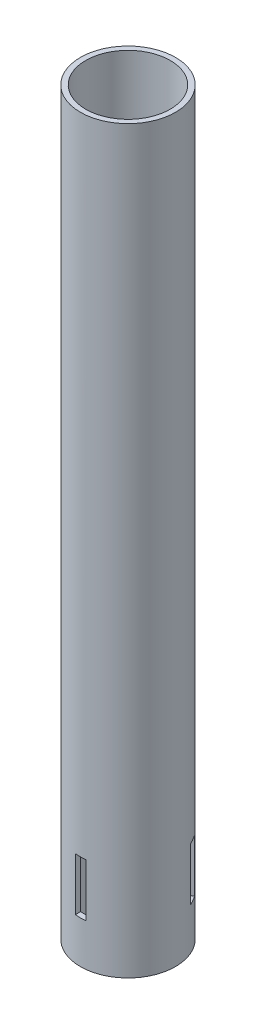
ISO-10303-21;
HEADER;
FILE_DESCRIPTION(('STEP AP214'),'2;1');
FILE_NAME('part.step','',(''),(''),'','','');
FILE_SCHEMA(('AUTOMOTIVE_DESIGN { 1 0 10303 214 1 1 1 1 }'));
ENDSEC;
DATA;
#1=APPLICATION_CONTEXT('core data for automotive mechanical design processes');
#2=APPLICATION_PROTOCOL_DEFINITION('international standard','automotive_design',2000,#1);
#3=PRODUCT_CONTEXT('',#1,'mechanical');
#4=PRODUCT('Part','Part','',(#3));
#5=PRODUCT_RELATED_PRODUCT_CATEGORY('part','',(#4));
#6=PRODUCT_DEFINITION_FORMATION('','',#4);
#7=PRODUCT_DEFINITION_CONTEXT('part definition',#1,'design');
#8=PRODUCT_DEFINITION('design','',#6,#7);
#9=PRODUCT_DEFINITION_SHAPE('','',#8);
#10=(LENGTH_UNIT() NAMED_UNIT(*) SI_UNIT(.MILLI.,.METRE.));
#11=(NAMED_UNIT(*) PLANE_ANGLE_UNIT() SI_UNIT($,.RADIAN.));
#12=(NAMED_UNIT(*) SI_UNIT($,.STERADIAN.) SOLID_ANGLE_UNIT());
#13=UNCERTAINTY_MEASURE_WITH_UNIT(LENGTH_MEASURE(1.E-05),#10,'distance_accuracy_value','');
#14=(GEOMETRIC_REPRESENTATION_CONTEXT(3) GLOBAL_UNCERTAINTY_ASSIGNED_CONTEXT((#13)) GLOBAL_UNIT_ASSIGNED_CONTEXT((#10,
#11,#12)) REPRESENTATION_CONTEXT('',''));
#15=CARTESIAN_POINT('',(0.,0.,0.));
#16=DIRECTION('',(0.,0.,1.));
#17=DIRECTION('',(1.,0.,0.));
#18=AXIS2_PLACEMENT_3D('',#15,#16,#17);
#19=CARTESIAN_POINT('',(0.,700.,0.));
#20=DIRECTION('',(0.,-1.,0.));
#21=DIRECTION('',(0.,0.,-1.));
#22=AXIS2_PLACEMENT_3D('',#19,#20,#21);
#23=CYLINDRICAL_SURFACE('',#22,45.);
#24=CARTESIAN_POINT('',(0.,40.,0.));
#25=DIRECTION('',(0.,1.,0.));
#26=DIRECTION('',(0.,0.,1.));
#27=AXIS2_PLACEMENT_3D('',#24,#25,#26);
#28=CIRCLE('',#27,45.);
#29=CARTESIAN_POINT('',(-5.,40.,44.7213595499958));
#30=VERTEX_POINT('',#29);
#31=CARTESIAN_POINT('',(5.,40.,44.7213595499958));
#32=VERTEX_POINT('',#31);
#33=EDGE_CURVE('E205',#30,#32,#28,.T.);
#34=ORIENTED_EDGE('',*,*,#33,.F.);
#35=DIRECTION('',(0.,-1.,0.));
#36=VECTOR('',#35,1.);
#37=CARTESIAN_POINT('',(-5.00000000000004,700.,44.7213595499958));
#38=LINE('',#37,#36);
#39=CARTESIAN_POINT('',(-5.00000000000004,90.,44.7213595499958));
#40=VERTEX_POINT('',#39);
#41=EDGE_CURVE('E194',#30,#40,#38,.F.);
#42=ORIENTED_EDGE('',*,*,#41,.T.);
#43=CARTESIAN_POINT('',(0.,90.,0.));
#44=DIRECTION('',(0.,1.,0.));
#45=DIRECTION('',(0.,0.,1.));
#46=AXIS2_PLACEMENT_3D('',#43,#44,#45);
#47=CIRCLE('',#46,45.);
#48=CARTESIAN_POINT('',(5.,90.,44.7213595499958));
#49=VERTEX_POINT('',#48);
#50=EDGE_CURVE('E198',#40,#49,#47,.T.);
#51=ORIENTED_EDGE('',*,*,#50,.T.);
#52=DIRECTION('',(0.,-1.,0.));
#53=VECTOR('',#52,1.);
#54=CARTESIAN_POINT('',(4.99999999999996,700.,44.7213595499958));
#55=LINE('',#54,#53);
#56=EDGE_CURVE('E202',#32,#49,#55,.F.);
#57=ORIENTED_EDGE('',*,*,#56,.F.);
#58=EDGE_LOOP('',(#34,#42,#51,#57));
#59=FACE_BOUND('',#58,.T.);
#60=CARTESIAN_POINT('',(0.,700.,0.));
#61=DIRECTION('',(0.,1.,0.));
#62=DIRECTION('',(0.,0.,1.));
#63=AXIS2_PLACEMENT_3D('',#60,#61,#62);
#64=CIRCLE('',#63,45.);
#65=CARTESIAN_POINT('',(0.,700.,45.));
#66=VERTEX_POINT('',#65);
#67=EDGE_CURVE('E217',#66,#66,#64,.T.);
#68=ORIENTED_EDGE('',*,*,#67,.F.);
#69=EDGE_LOOP('',(#68));
#70=FACE_BOUND('',#69,.T.);
#71=CARTESIAN_POINT('',(0.,0.,0.));
#72=DIRECTION('',(0.,1.,0.));
#73=DIRECTION('',(0.,0.,1.));
#74=AXIS2_PLACEMENT_3D('',#71,#72,#73);
#75=CIRCLE('',#74,45.);
#76=CARTESIAN_POINT('',(0.,0.,45.));
#77=VERTEX_POINT('',#76);
#78=EDGE_CURVE('E213',#77,#77,#75,.T.);
#79=ORIENTED_EDGE('',*,*,#78,.T.);
#80=EDGE_LOOP('',(#79));
#81=FACE_BOUND('',#80,.T.);
#82=CARTESIAN_POINT('',(0.,40.,0.));
#83=DIRECTION('',(0.,1.,0.));
#84=DIRECTION('',(0.,0.,1.));
#85=AXIS2_PLACEMENT_3D('',#82,#83,#84);
#86=CIRCLE('',#85,45.);
#87=CARTESIAN_POINT('',(-36.2298334620744,40.,-26.6908067939198));
#88=VERTEX_POINT('',#87);
#89=CARTESIAN_POINT('',(-41.2298334620743,40.,-18.0305527560754));
#90=VERTEX_POINT('',#89);
#91=EDGE_CURVE('E175',#88,#90,#86,.T.);
#92=ORIENTED_EDGE('',*,*,#91,.F.);
#93=DIRECTION('',(0.,-1.,0.));
#94=VECTOR('',#93,1.);
#95=CARTESIAN_POINT('',(-36.2298334620744,700.,-26.6908067939198));
#96=LINE('',#95,#94);
#97=CARTESIAN_POINT('',(-36.2298334620744,90.,-26.6908067939198));
#98=VERTEX_POINT('',#97);
#99=EDGE_CURVE('E145',#88,#98,#96,.F.);
#100=ORIENTED_EDGE('',*,*,#99,.T.);
#101=CARTESIAN_POINT('',(0.,90.,0.));
#102=DIRECTION('',(0.,1.,0.));
#103=DIRECTION('',(0.,0.,1.));
#104=AXIS2_PLACEMENT_3D('',#101,#102,#103);
#105=CIRCLE('',#104,45.);
#106=CARTESIAN_POINT('',(-41.2298334620743,90.,-18.0305527560753));
#107=VERTEX_POINT('',#106);
#108=EDGE_CURVE('E151',#98,#107,#105,.T.);
#109=ORIENTED_EDGE('',*,*,#108,.T.);
#110=DIRECTION('',(0.,-1.,0.));
#111=VECTOR('',#110,1.);
#112=CARTESIAN_POINT('',(-41.2298334620743,700.,-18.0305527560754));
#113=LINE('',#112,#111);
#114=EDGE_CURVE('E136',#90,#107,#113,.F.);
#115=ORIENTED_EDGE('',*,*,#114,.F.);
#116=EDGE_LOOP('',(#92,#100,#109,#115));
#117=FACE_BOUND('',#116,.T.);
#118=CARTESIAN_POINT('',(41.2298334620741,40.,-18.0305527560759));
#119=VERTEX_POINT('',#118);
#120=CARTESIAN_POINT('',(36.229833462074,40.,-26.6908067939203));
#121=VERTEX_POINT('',#120);
#122=EDGE_CURVE('E178',#119,#121,#86,.T.);
#123=ORIENTED_EDGE('',*,*,#122,.F.);
#124=DIRECTION('',(0.,-1.,0.));
#125=VECTOR('',#124,1.);
#126=CARTESIAN_POINT('',(41.2298334620741,700.,-18.0305527560759));
#127=LINE('',#126,#125);
#128=CARTESIAN_POINT('',(41.2298334620741,90.,-18.0305527560759));
#129=VERTEX_POINT('',#128);
#130=EDGE_CURVE('E163',#119,#129,#127,.F.);
#131=ORIENTED_EDGE('',*,*,#130,.T.);
#132=CARTESIAN_POINT('',(36.2298334620741,90.,-26.6908067939203));
#133=VERTEX_POINT('',#132);
#134=EDGE_CURVE('E162',#129,#133,#105,.T.);
#135=ORIENTED_EDGE('',*,*,#134,.T.);
#136=DIRECTION('',(0.,-1.,0.));
#137=VECTOR('',#136,1.);
#138=CARTESIAN_POINT('',(36.2298334620741,700.,-26.6908067939202));
#139=LINE('',#138,#137);
#140=EDGE_CURVE('E168',#121,#133,#139,.F.);
#141=ORIENTED_EDGE('',*,*,#140,.F.);
#142=EDGE_LOOP('',(#123,#131,#135,#141));
#143=FACE_BOUND('',#142,.T.);
#144=ADVANCED_FACE('F47',(#59,#70,#81,#117,#143),#23,.T.);
#145=CARTESIAN_POINT('',(0.,700.,0.));
#146=DIRECTION('',(0.,-1.,0.));
#147=DIRECTION('',(0.,0.,-1.));
#148=AXIS2_PLACEMENT_3D('',#145,#146,#147);
#149=CYLINDRICAL_SURFACE('',#148,40.);
#150=DIRECTION('',(0.,-1.,0.));
#151=VECTOR('',#150,1.);
#152=CARTESIAN_POINT('',(-31.869317712169,700.,-24.1732618519064));
#153=LINE('',#152,#151);
#154=CARTESIAN_POINT('',(-31.869317712169,40.,-24.1732618519063));
#155=VERTEX_POINT('',#154);
#156=CARTESIAN_POINT('',(-31.869317712169,90.,-24.1732618519063));
#157=VERTEX_POINT('',#156);
#158=EDGE_CURVE('E246',#155,#157,#153,.F.);
#159=ORIENTED_EDGE('',*,*,#158,.F.);
#160=CARTESIAN_POINT('',(0.,40.,0.));
#161=DIRECTION('',(0.,1.,0.));
#162=DIRECTION('',(0.,0.,1.));
#163=AXIS2_PLACEMENT_3D('',#160,#161,#162);
#164=CIRCLE('',#163,40.);
#165=CARTESIAN_POINT('',(-36.869317712169,40.,-15.5130078140619));
#166=VERTEX_POINT('',#165);
#167=EDGE_CURVE('E57',#155,#166,#164,.T.);
#168=ORIENTED_EDGE('',*,*,#167,.T.);
#169=DIRECTION('',(0.,-1.,0.));
#170=VECTOR('',#169,1.);
#171=CARTESIAN_POINT('',(-36.8693177121689,700.,-15.5130078140619));
#172=LINE('',#171,#170);
#173=CARTESIAN_POINT('',(-36.8693177121689,90.,-15.5130078140619));
#174=VERTEX_POINT('',#173);
#175=EDGE_CURVE('E238',#166,#174,#172,.F.);
#176=ORIENTED_EDGE('',*,*,#175,.T.);
#177=CARTESIAN_POINT('',(0.,90.,0.));
#178=DIRECTION('',(0.,1.,0.));
#179=DIRECTION('',(0.,0.,1.));
#180=AXIS2_PLACEMENT_3D('',#177,#178,#179);
#181=CIRCLE('',#180,40.);
#182=EDGE_CURVE('E154',#157,#174,#181,.T.);
#183=ORIENTED_EDGE('',*,*,#182,.F.);
#184=EDGE_LOOP('',(#159,#168,#176,#183));
#185=FACE_BOUND('',#184,.T.);
#186=CARTESIAN_POINT('',(0.,700.,0.));
#187=DIRECTION('',(0.,1.,0.));
#188=DIRECTION('',(0.,0.,1.));
#189=AXIS2_PLACEMENT_3D('',#186,#187,#188);
#190=CIRCLE('',#189,40.);
#191=CARTESIAN_POINT('',(0.,700.,40.));
#192=VERTEX_POINT('',#191);
#193=EDGE_CURVE('E209',#192,#192,#190,.T.);
#194=ORIENTED_EDGE('',*,*,#193,.T.);
#195=EDGE_LOOP('',(#194));
#196=FACE_BOUND('',#195,.T.);
#197=CARTESIAN_POINT('',(0.,0.,0.));
#198=DIRECTION('',(0.,1.,0.));
#199=DIRECTION('',(0.,0.,1.));
#200=AXIS2_PLACEMENT_3D('',#197,#198,#199);
#201=CIRCLE('',#200,40.);
#202=CARTESIAN_POINT('',(0.,0.,40.));
#203=VERTEX_POINT('',#202);
#204=EDGE_CURVE('E208',#203,#203,#201,.T.);
#205=ORIENTED_EDGE('',*,*,#204,.F.);
#206=EDGE_LOOP('',(#205));
#207=FACE_BOUND('',#206,.T.);
#208=DIRECTION('',(0.,-1.,0.));
#209=VECTOR('',#208,1.);
#210=CARTESIAN_POINT('',(-5.00000000000004,700.,39.6862696659689));
#211=LINE('',#210,#209);
#212=CARTESIAN_POINT('',(-5.00000000000004,40.,39.6862696659689));
#213=VERTEX_POINT('',#212);
#214=CARTESIAN_POINT('',(-5.,90.,39.6862696659689));
#215=VERTEX_POINT('',#214);
#216=EDGE_CURVE('E221',#213,#215,#211,.F.);
#217=ORIENTED_EDGE('',*,*,#216,.F.);
#218=CARTESIAN_POINT('',(0.,40.,0.));
#219=DIRECTION('',(0.,1.,0.));
#220=DIRECTION('',(0.,0.,1.));
#221=AXIS2_PLACEMENT_3D('',#218,#219,#220);
#222=CIRCLE('',#221,40.);
#223=CARTESIAN_POINT('',(5.,40.,39.6862696659689));
#224=VERTEX_POINT('',#223);
#225=EDGE_CURVE('E234',#213,#224,#222,.T.);
#226=ORIENTED_EDGE('',*,*,#225,.T.);
#227=DIRECTION('',(0.,-1.,0.));
#228=VECTOR('',#227,1.);
#229=CARTESIAN_POINT('',(4.99999999999996,700.,39.6862696659689));
#230=LINE('',#229,#228);
#231=CARTESIAN_POINT('',(5.,90.,39.6862696659689));
#232=VERTEX_POINT('',#231);
#233=EDGE_CURVE('E230',#224,#232,#230,.F.);
#234=ORIENTED_EDGE('',*,*,#233,.T.);
#235=CARTESIAN_POINT('',(0.,90.,0.));
#236=DIRECTION('',(0.,1.,0.));
#237=DIRECTION('',(0.,0.,1.));
#238=AXIS2_PLACEMENT_3D('',#235,#236,#237);
#239=CIRCLE('',#238,40.);
#240=EDGE_CURVE('E227',#215,#232,#239,.T.);
#241=ORIENTED_EDGE('',*,*,#240,.F.);
#242=EDGE_LOOP('',(#217,#226,#234,#241));
#243=FACE_BOUND('',#242,.T.);
#244=DIRECTION('',(0.,-1.,0.));
#245=VECTOR('',#244,1.);
#246=CARTESIAN_POINT('',(36.8693177121687,700.,-15.5130078140624));
#247=LINE('',#246,#245);
#248=CARTESIAN_POINT('',(36.8693177121687,40.,-15.5130078140624));
#249=VERTEX_POINT('',#248);
#250=CARTESIAN_POINT('',(36.8693177121687,90.,-15.5130078140624));
#251=VERTEX_POINT('',#250);
#252=EDGE_CURVE('E248',#249,#251,#247,.F.);
#253=ORIENTED_EDGE('',*,*,#252,.F.);
#254=CARTESIAN_POINT('',(31.8693177121687,40.,-24.1732618519068));
#255=VERTEX_POINT('',#254);
#256=EDGE_CURVE('E11',#249,#255,#164,.T.);
#257=ORIENTED_EDGE('',*,*,#256,.T.);
#258=DIRECTION('',(0.,-1.,0.));
#259=VECTOR('',#258,1.);
#260=CARTESIAN_POINT('',(31.8693177121687,700.,-24.1732618519067));
#261=LINE('',#260,#259);
#262=CARTESIAN_POINT('',(31.8693177121687,90.,-24.1732618519068));
#263=VERTEX_POINT('',#262);
#264=EDGE_CURVE('E50',#255,#263,#261,.F.);
#265=ORIENTED_EDGE('',*,*,#264,.T.);
#266=EDGE_CURVE('E242',#251,#263,#181,.T.);
#267=ORIENTED_EDGE('',*,*,#266,.F.);
#268=EDGE_LOOP('',(#253,#257,#265,#267));
#269=FACE_BOUND('',#268,.T.);
#270=ADVANCED_FACE('F259',(#185,#196,#207,#243,#269),#149,.F.);
#271=CARTESIAN_POINT('',(0.,700.,0.));
#272=DIRECTION('',(0.,1.,0.));
#273=DIRECTION('',(0.,0.,1.));
#274=AXIS2_PLACEMENT_3D('',#271,#272,#273);
#275=PLANE('',#274);
#276=ORIENTED_EDGE('',*,*,#67,.T.);
#277=EDGE_LOOP('',(#276));
#278=FACE_BOUND('',#277,.T.);
#279=ORIENTED_EDGE('',*,*,#193,.F.);
#280=EDGE_LOOP('',(#279));
#281=FACE_BOUND('',#280,.T.);
#282=ADVANCED_FACE('F313',(#278,#281),#275,.T.);
#283=CARTESIAN_POINT('',(0.,0.,0.));
#284=DIRECTION('',(0.,1.,0.));
#285=DIRECTION('',(0.,0.,1.));
#286=AXIS2_PLACEMENT_3D('',#283,#284,#285);
#287=PLANE('',#286);
#288=ORIENTED_EDGE('',*,*,#78,.F.);
#289=EDGE_LOOP('',(#288));
#290=FACE_BOUND('',#289,.T.);
#291=ORIENTED_EDGE('',*,*,#204,.T.);
#292=EDGE_LOOP('',(#291));
#293=FACE_BOUND('',#292,.T.);
#294=ADVANCED_FACE('F322',(#290,#293),#287,.F.);
#295=CARTESIAN_POINT('',(-5.,40.,62.));
#296=DIRECTION('',(0.,1.,0.));
#297=DIRECTION('',(0.,0.,1.));
#298=AXIS2_PLACEMENT_3D('',#295,#296,#297);
#299=PLANE('',#298);
#300=ORIENTED_EDGE('',*,*,#33,.T.);
#301=DIRECTION('',(0.,0.,-1.));
#302=VECTOR('',#301,1.);
#303=CARTESIAN_POINT('',(5.,40.,62.));
#304=LINE('',#303,#302);
#305=EDGE_CURVE('E190',#32,#224,#304,.T.);
#306=ORIENTED_EDGE('',*,*,#305,.T.);
#307=ORIENTED_EDGE('',*,*,#225,.F.);
#308=DIRECTION('',(0.,0.,-1.));
#309=VECTOR('',#308,1.);
#310=CARTESIAN_POINT('',(-5.,40.,62.));
#311=LINE('',#310,#309);
#312=EDGE_CURVE('E179',#30,#213,#311,.T.);
#313=ORIENTED_EDGE('',*,*,#312,.F.);
#314=EDGE_LOOP('',(#300,#306,#307,#313));
#315=FACE_BOUND('',#314,.T.);
#316=ADVANCED_FACE('F325',(#315),#299,.T.);
#317=CARTESIAN_POINT('',(5.,40.,62.));
#318=DIRECTION('',(-1.,0.,0.));
#319=DIRECTION('',(0.,-1.,0.));
#320=AXIS2_PLACEMENT_3D('',#317,#318,#319);
#321=PLANE('',#320);
#322=ORIENTED_EDGE('',*,*,#56,.T.);
#323=DIRECTION('',(0.,0.,-1.));
#324=VECTOR('',#323,1.);
#325=CARTESIAN_POINT('',(5.,90.,62.));
#326=LINE('',#325,#324);
#327=EDGE_CURVE('E186',#49,#232,#326,.T.);
#328=ORIENTED_EDGE('',*,*,#327,.T.);
#329=ORIENTED_EDGE('',*,*,#233,.F.);
#330=ORIENTED_EDGE('',*,*,#305,.F.);
#331=EDGE_LOOP('',(#322,#328,#329,#330));
#332=FACE_BOUND('',#331,.T.);
#333=ADVANCED_FACE('F342',(#332),#321,.T.);
#334=CARTESIAN_POINT('',(-5.,90.,62.));
#335=DIRECTION('',(0.,1.,0.));
#336=DIRECTION('',(0.,0.,1.));
#337=AXIS2_PLACEMENT_3D('',#334,#335,#336);
#338=PLANE('',#337);
#339=DIRECTION('',(0.,0.,-1.));
#340=VECTOR('',#339,1.);
#341=CARTESIAN_POINT('',(-5.,90.,62.));
#342=LINE('',#341,#340);
#343=EDGE_CURVE('E182',#40,#215,#342,.T.);
#344=ORIENTED_EDGE('',*,*,#343,.T.);
#345=ORIENTED_EDGE('',*,*,#240,.T.);
#346=ORIENTED_EDGE('',*,*,#327,.F.);
#347=ORIENTED_EDGE('',*,*,#50,.F.);
#348=EDGE_LOOP('',(#344,#345,#346,#347));
#349=FACE_BOUND('',#348,.T.);
#350=ADVANCED_FACE('F337',(#349),#338,.F.);
#351=CARTESIAN_POINT('',(-5.,40.,62.));
#352=DIRECTION('',(-1.,0.,0.));
#353=DIRECTION('',(0.,-1.,0.));
#354=AXIS2_PLACEMENT_3D('',#351,#352,#353);
#355=PLANE('',#354);
#356=ORIENTED_EDGE('',*,*,#312,.T.);
#357=ORIENTED_EDGE('',*,*,#216,.T.);
#358=ORIENTED_EDGE('',*,*,#343,.F.);
#359=ORIENTED_EDGE('',*,*,#41,.F.);
#360=EDGE_LOOP('',(#356,#357,#358,#359));
#361=FACE_BOUND('',#360,.T.);
#362=ADVANCED_FACE('F333',(#361),#355,.F.);
#363=CARTESIAN_POINT('',(-56.1935750346355,40.,-26.6698729810773));
#364=DIRECTION('',(0.499999999999992,0.,-0.866025403784443));
#365=DIRECTION('',(-0.866025403784443,0.,-0.499999999999992));
#366=AXIS2_PLACEMENT_3D('',#363,#364,#365);
#367=PLANE('',#366);
#368=ORIENTED_EDGE('',*,*,#114,.T.);
#369=DIRECTION('',(0.866025403784443,0.,0.499999999999992));
#370=VECTOR('',#369,1.);
#371=CARTESIAN_POINT('',(-56.1935750346355,90.,-26.6698729810773));
#372=LINE('',#371,#370);
#373=EDGE_CURVE('E139',#107,#174,#372,.T.);
#374=ORIENTED_EDGE('',*,*,#373,.T.);
#375=ORIENTED_EDGE('',*,*,#175,.F.);
#376=DIRECTION('',(0.866025403784443,0.,0.499999999999992));
#377=VECTOR('',#376,1.);
#378=CARTESIAN_POINT('',(-56.1935750346355,40.,-26.6698729810773));
#379=LINE('',#378,#377);
#380=EDGE_CURVE('E72',#90,#166,#379,.T.);
#381=ORIENTED_EDGE('',*,*,#380,.F.);
#382=EDGE_LOOP('',(#368,#374,#375,#381));
#383=FACE_BOUND('',#382,.T.);
#384=ADVANCED_FACE('F138',(#383),#367,.T.);
#385=CARTESIAN_POINT('',(-51.1935750346355,40.,-35.3301270189217));
#386=DIRECTION('',(0.499999999999992,0.,-0.866025403784443));
#387=DIRECTION('',(-0.866025403784443,0.,-0.499999999999992));
#388=AXIS2_PLACEMENT_3D('',#385,#386,#387);
#389=PLANE('',#388);
#390=DIRECTION('',(0.866025403784443,0.,0.499999999999992));
#391=VECTOR('',#390,1.);
#392=CARTESIAN_POINT('',(-51.1935750346355,40.,-35.3301270189217));
#393=LINE('',#392,#391);
#394=EDGE_CURVE('E286',#88,#155,#393,.T.);
#395=ORIENTED_EDGE('',*,*,#394,.T.);
#396=ORIENTED_EDGE('',*,*,#158,.T.);
#397=DIRECTION('',(0.866025403784443,0.,0.499999999999992));
#398=VECTOR('',#397,1.);
#399=CARTESIAN_POINT('',(-51.1935750346355,90.,-35.3301270189217));
#400=LINE('',#399,#398);
#401=EDGE_CURVE('E157',#98,#157,#400,.T.);
#402=ORIENTED_EDGE('',*,*,#401,.F.);
#403=ORIENTED_EDGE('',*,*,#99,.F.);
#404=EDGE_LOOP('',(#395,#396,#402,#403));
#405=FACE_BOUND('',#404,.T.);
#406=ADVANCED_FACE('F292',(#405),#389,.F.);
#407=CARTESIAN_POINT('',(56.1935750346351,90.,-26.6698729810781));
#408=DIRECTION('',(0.,1.,0.));
#409=DIRECTION('',(0.,0.,1.));
#410=AXIS2_PLACEMENT_3D('',#407,#408,#409);
#411=PLANE('',#410);
#412=ORIENTED_EDGE('',*,*,#401,.T.);
#413=ORIENTED_EDGE('',*,*,#182,.T.);
#414=ORIENTED_EDGE('',*,*,#373,.F.);
#415=ORIENTED_EDGE('',*,*,#108,.F.);
#416=EDGE_LOOP('',(#412,#413,#414,#415));
#417=FACE_BOUND('',#416,.T.);
#418=ADVANCED_FACE('F150',(#417),#411,.F.);
#419=CARTESIAN_POINT('',(56.1935750346351,40.,-26.6698729810781));
#420=DIRECTION('',(0.,1.,0.));
#421=DIRECTION('',(0.,0.,1.));
#422=AXIS2_PLACEMENT_3D('',#419,#420,#421);
#423=PLANE('',#422);
#424=ORIENTED_EDGE('',*,*,#91,.T.);
#425=ORIENTED_EDGE('',*,*,#380,.T.);
#426=ORIENTED_EDGE('',*,*,#167,.F.);
#427=ORIENTED_EDGE('',*,*,#394,.F.);
#428=EDGE_LOOP('',(#424,#425,#426,#427));
#429=FACE_BOUND('',#428,.T.);
#430=ADVANCED_FACE('F296',(#429),#423,.T.);
#431=ORIENTED_EDGE('',*,*,#122,.T.);
#432=DIRECTION('',(-0.866025403784436,0.,0.500000000000004));
#433=VECTOR('',#432,1.);
#434=CARTESIAN_POINT('',(51.193575034635,40.,-35.3301270189224));
#435=LINE('',#434,#433);
#436=EDGE_CURVE('E146',#121,#255,#435,.T.);
#437=ORIENTED_EDGE('',*,*,#436,.T.);
#438=ORIENTED_EDGE('',*,*,#256,.F.);
#439=DIRECTION('',(-0.866025403784436,0.,0.500000000000004));
#440=VECTOR('',#439,1.);
#441=CARTESIAN_POINT('',(56.1935750346351,40.,-26.6698729810781));
#442=LINE('',#441,#440);
#443=EDGE_CURVE('E279',#119,#249,#442,.T.);
#444=ORIENTED_EDGE('',*,*,#443,.F.);
#445=EDGE_LOOP('',(#431,#437,#438,#444));
#446=FACE_BOUND('',#445,.T.);
#447=ADVANCED_FACE('F268',(#446),#423,.T.);
#448=CARTESIAN_POINT('',(51.193575034635,40.,-35.3301270189224));
#449=DIRECTION('',(0.500000000000004,0.,0.866025403784436));
#450=DIRECTION('',(0.866025403784436,0.,-0.500000000000004));
#451=AXIS2_PLACEMENT_3D('',#448,#449,#450);
#452=PLANE('',#451);
#453=ORIENTED_EDGE('',*,*,#140,.T.);
#454=DIRECTION('',(-0.866025403784436,0.,0.500000000000004));
#455=VECTOR('',#454,1.);
#456=CARTESIAN_POINT('',(51.193575034635,90.,-35.3301270189224));
#457=LINE('',#456,#455);
#458=EDGE_CURVE('E266',#133,#263,#457,.T.);
#459=ORIENTED_EDGE('',*,*,#458,.T.);
#460=ORIENTED_EDGE('',*,*,#264,.F.);
#461=ORIENTED_EDGE('',*,*,#436,.F.);
#462=EDGE_LOOP('',(#453,#459,#460,#461));
#463=FACE_BOUND('',#462,.T.);
#464=ADVANCED_FACE('F264',(#463),#452,.T.);
#465=DIRECTION('',(-0.866025403784436,0.,0.500000000000004));
#466=VECTOR('',#465,1.);
#467=CARTESIAN_POINT('',(56.1935750346351,90.,-26.6698729810781));
#468=LINE('',#467,#466);
#469=EDGE_CURVE('E64',#129,#251,#468,.T.);
#470=ORIENTED_EDGE('',*,*,#469,.T.);
#471=ORIENTED_EDGE('',*,*,#266,.T.);
#472=ORIENTED_EDGE('',*,*,#458,.F.);
#473=ORIENTED_EDGE('',*,*,#134,.F.);
#474=EDGE_LOOP('',(#470,#471,#472,#473));
#475=FACE_BOUND('',#474,.T.);
#476=ADVANCED_FACE('F304',(#475),#411,.F.);
#477=CARTESIAN_POINT('',(56.1935750346351,40.,-26.6698729810781));
#478=DIRECTION('',(0.500000000000004,0.,0.866025403784436));
#479=DIRECTION('',(0.866025403784436,0.,-0.500000000000004));
#480=AXIS2_PLACEMENT_3D('',#477,#478,#479);
#481=PLANE('',#480);
#482=ORIENTED_EDGE('',*,*,#443,.T.);
#483=ORIENTED_EDGE('',*,*,#252,.T.);
#484=ORIENTED_EDGE('',*,*,#469,.F.);
#485=ORIENTED_EDGE('',*,*,#130,.F.);
#486=EDGE_LOOP('',(#482,#483,#484,#485));
#487=FACE_BOUND('',#486,.T.);
#488=ADVANCED_FACE('F452',(#487),#481,.F.);
#489=CLOSED_SHELL('',(#144,#270,#282,#294,#316,#333,#350,#362,#384,#406,#418,#430,#447,#464,
#476,#488));
#490=MANIFOLD_SOLID_BREP('B2',#489);
#491=ADVANCED_BREP_SHAPE_REPRESENTATION('',(#18,#490),#14);
#492=SHAPE_DEFINITION_REPRESENTATION(#9,#491);
ENDSEC;
END-ISO-10303-21;
